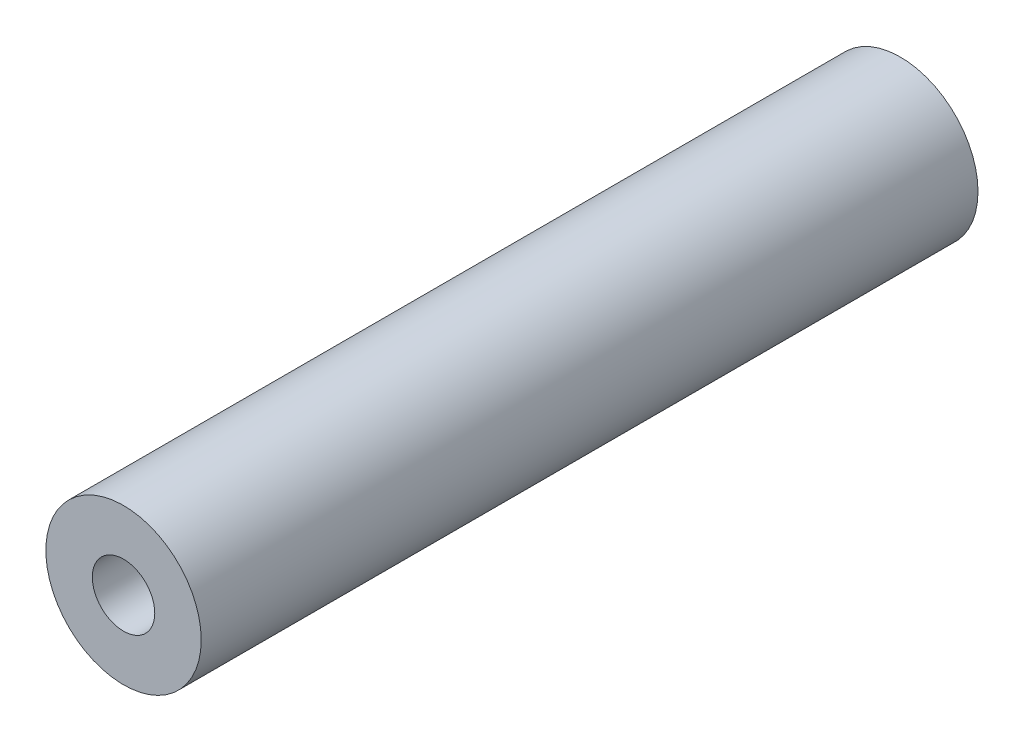
ISO-10303-21;
HEADER;
FILE_DESCRIPTION(('STEP AP214'),'2;1');
FILE_NAME('part.step','',(''),(''),'','','');
FILE_SCHEMA(('AUTOMOTIVE_DESIGN { 1 0 10303 214 1 1 1 1 }'));
ENDSEC;
DATA;
#1=APPLICATION_CONTEXT('core data for automotive mechanical design processes');
#2=APPLICATION_PROTOCOL_DEFINITION('international standard','automotive_design',2000,#1);
#3=PRODUCT_CONTEXT('',#1,'mechanical');
#4=PRODUCT('Part','Part','',(#3));
#5=PRODUCT_RELATED_PRODUCT_CATEGORY('part','',(#4));
#6=PRODUCT_DEFINITION_FORMATION('','',#4);
#7=PRODUCT_DEFINITION_CONTEXT('part definition',#1,'design');
#8=PRODUCT_DEFINITION('design','',#6,#7);
#9=PRODUCT_DEFINITION_SHAPE('','',#8);
#10=(LENGTH_UNIT() NAMED_UNIT(*) SI_UNIT(.MILLI.,.METRE.));
#11=(NAMED_UNIT(*) PLANE_ANGLE_UNIT() SI_UNIT($,.RADIAN.));
#12=(NAMED_UNIT(*) SI_UNIT($,.STERADIAN.) SOLID_ANGLE_UNIT());
#13=UNCERTAINTY_MEASURE_WITH_UNIT(LENGTH_MEASURE(1.E-05),#10,'distance_accuracy_value','');
#14=(GEOMETRIC_REPRESENTATION_CONTEXT(3) GLOBAL_UNCERTAINTY_ASSIGNED_CONTEXT((#13)) GLOBAL_UNIT_ASSIGNED_CONTEXT((#10,
#11,#12)) REPRESENTATION_CONTEXT('',''));
#15=CARTESIAN_POINT('',(0.,0.,0.));
#16=DIRECTION('',(0.,0.,1.));
#17=DIRECTION('',(1.,0.,0.));
#18=AXIS2_PLACEMENT_3D('',#15,#16,#17);
#19=CARTESIAN_POINT('',(0.,0.,31.75));
#20=DIRECTION('',(0.,0.,-1.));
#21=DIRECTION('',(-1.,0.,0.));
#22=AXIS2_PLACEMENT_3D('',#19,#20,#21);
#23=CYLINDRICAL_SURFACE('',#22,6.35);
#24=CARTESIAN_POINT('',(0.,0.,31.75));
#25=DIRECTION('',(0.,0.,1.));
#26=DIRECTION('',(1.,0.,0.));
#27=AXIS2_PLACEMENT_3D('',#24,#25,#26);
#28=CIRCLE('',#27,6.35);
#29=CARTESIAN_POINT('',(6.35,0.,31.75));
#30=VERTEX_POINT('',#29);
#31=EDGE_CURVE('E11',#30,#30,#28,.T.);
#32=ORIENTED_EDGE('',*,*,#31,.F.);
#33=EDGE_LOOP('',(#32));
#34=FACE_BOUND('',#33,.T.);
#35=CARTESIAN_POINT('',(0.,0.,-31.75));
#36=DIRECTION('',(0.,0.,1.));
#37=DIRECTION('',(1.,0.,0.));
#38=AXIS2_PLACEMENT_3D('',#35,#36,#37);
#39=CIRCLE('',#38,6.35);
#40=CARTESIAN_POINT('',(6.35,0.,-31.75));
#41=VERTEX_POINT('',#40);
#42=EDGE_CURVE('E42',#41,#41,#39,.T.);
#43=ORIENTED_EDGE('',*,*,#42,.T.);
#44=EDGE_LOOP('',(#43));
#45=FACE_BOUND('',#44,.T.);
#46=ADVANCED_FACE('F39',(#34,#45),#23,.T.);
#47=CARTESIAN_POINT('',(0.,0.,31.75));
#48=DIRECTION('',(0.,0.,1.));
#49=DIRECTION('',(1.,0.,0.));
#50=AXIS2_PLACEMENT_3D('',#47,#48,#49);
#51=PLANE('',#50);
#52=CARTESIAN_POINT('',(0.,0.,31.75));
#53=DIRECTION('',(0.,0.,1.));
#54=DIRECTION('',(1.,0.,0.));
#55=AXIS2_PLACEMENT_3D('',#52,#53,#54);
#56=CIRCLE('',#55,2.5527);
#57=CARTESIAN_POINT('',(2.5527,0.,31.75));
#58=VERTEX_POINT('',#57);
#59=EDGE_CURVE('E63',#58,#58,#56,.T.);
#60=ORIENTED_EDGE('',*,*,#59,.F.);
#61=EDGE_LOOP('',(#60));
#62=FACE_BOUND('',#61,.T.);
#63=ORIENTED_EDGE('',*,*,#31,.T.);
#64=EDGE_LOOP('',(#63));
#65=FACE_BOUND('',#64,.T.);
#66=ADVANCED_FACE('F81',(#62,#65),#51,.T.);
#67=CARTESIAN_POINT('',(0.,0.,-31.75));
#68=DIRECTION('',(0.,0.,1.));
#69=DIRECTION('',(1.,0.,0.));
#70=AXIS2_PLACEMENT_3D('',#67,#68,#69);
#71=PLANE('',#70);
#72=CARTESIAN_POINT('',(0.,0.,-31.75));
#73=DIRECTION('',(0.,0.,-1.));
#74=DIRECTION('',(-1.,0.,0.));
#75=AXIS2_PLACEMENT_3D('',#72,#73,#74);
#76=CIRCLE('',#75,2.5527);
#77=CARTESIAN_POINT('',(-2.5527,0.,-31.75));
#78=VERTEX_POINT('',#77);
#79=EDGE_CURVE('E62',#78,#78,#76,.T.);
#80=ORIENTED_EDGE('',*,*,#79,.F.);
#81=EDGE_LOOP('',(#80));
#82=FACE_BOUND('',#81,.T.);
#83=ORIENTED_EDGE('',*,*,#42,.F.);
#84=EDGE_LOOP('',(#83));
#85=FACE_BOUND('',#84,.T.);
#86=ADVANCED_FACE('F78',(#82,#85),#71,.F.);
#87=CARTESIAN_POINT('',(0.,0.,-15.24));
#88=DIRECTION('',(0.,0.,-1.));
#89=DIRECTION('',(-1.,0.,0.));
#90=AXIS2_PLACEMENT_3D('',#87,#88,#89);
#91=CONICAL_SURFACE('',#90,2.5527,1.02974425867665);
#92=CARTESIAN_POINT('',(0.,0.,-13.7061830978083));
#93=VERTEX_POINT('',#92);
#94=VERTEX_LOOP('',#93);
#95=FACE_BOUND('',#94,.T.);
#96=CARTESIAN_POINT('',(0.,0.,-15.24));
#97=DIRECTION('',(0.,0.,-1.));
#98=DIRECTION('',(-1.,0.,0.));
#99=AXIS2_PLACEMENT_3D('',#96,#97,#98);
#100=CIRCLE('',#99,2.5527);
#101=CARTESIAN_POINT('',(-2.5527,0.,-15.24));
#102=VERTEX_POINT('',#101);
#103=EDGE_CURVE('E66',#102,#102,#100,.T.);
#104=ORIENTED_EDGE('',*,*,#103,.T.);
#105=EDGE_LOOP('',(#104));
#106=FACE_BOUND('',#105,.T.);
#107=ADVANCED_FACE('F80',(#95,#106),#91,.F.);
#108=CARTESIAN_POINT('',(0.,0.,-31.75));
#109=DIRECTION('',(0.,0.,-1.));
#110=DIRECTION('',(-1.,0.,0.));
#111=AXIS2_PLACEMENT_3D('',#108,#109,#110);
#112=CYLINDRICAL_SURFACE('',#111,2.5527);
#113=ORIENTED_EDGE('',*,*,#103,.F.);
#114=EDGE_LOOP('',(#113));
#115=FACE_BOUND('',#114,.T.);
#116=ORIENTED_EDGE('',*,*,#79,.T.);
#117=EDGE_LOOP('',(#116));
#118=FACE_BOUND('',#117,.T.);
#119=ADVANCED_FACE('F56',(#115,#118),#112,.F.);
#120=CARTESIAN_POINT('',(0.,0.,15.24));
#121=DIRECTION('',(0.,0.,1.));
#122=DIRECTION('',(1.,0.,0.));
#123=AXIS2_PLACEMENT_3D('',#120,#121,#122);
#124=CONICAL_SURFACE('',#123,2.5527,1.02974425867665);
#125=CARTESIAN_POINT('',(0.,0.,13.7061830978083));
#126=VERTEX_POINT('',#125);
#127=VERTEX_LOOP('',#126);
#128=FACE_BOUND('',#127,.T.);
#129=CARTESIAN_POINT('',(0.,0.,15.24));
#130=DIRECTION('',(0.,0.,1.));
#131=DIRECTION('',(1.,0.,0.));
#132=AXIS2_PLACEMENT_3D('',#129,#130,#131);
#133=CIRCLE('',#132,2.5527);
#134=CARTESIAN_POINT('',(2.5527,0.,15.24));
#135=VERTEX_POINT('',#134);
#136=EDGE_CURVE('E60',#135,#135,#133,.T.);
#137=ORIENTED_EDGE('',*,*,#136,.T.);
#138=EDGE_LOOP('',(#137));
#139=FACE_BOUND('',#138,.T.);
#140=ADVANCED_FACE('F52',(#128,#139),#124,.F.);
#141=CARTESIAN_POINT('',(0.,0.,31.75));
#142=DIRECTION('',(0.,0.,1.));
#143=DIRECTION('',(1.,0.,0.));
#144=AXIS2_PLACEMENT_3D('',#141,#142,#143);
#145=CYLINDRICAL_SURFACE('',#144,2.5527);
#146=ORIENTED_EDGE('',*,*,#136,.F.);
#147=EDGE_LOOP('',(#146));
#148=FACE_BOUND('',#147,.T.);
#149=ORIENTED_EDGE('',*,*,#59,.T.);
#150=EDGE_LOOP('',(#149));
#151=FACE_BOUND('',#150,.T.);
#152=ADVANCED_FACE('F55',(#148,#151),#145,.F.);
#153=CLOSED_SHELL('',(#46,#66,#86,#107,#119,#140,#152));
#154=MANIFOLD_SOLID_BREP('B2',#153);
#155=ADVANCED_BREP_SHAPE_REPRESENTATION('',(#18,#154),#14);
#156=SHAPE_DEFINITION_REPRESENTATION(#9,#155);
ENDSEC;
END-ISO-10303-21;
